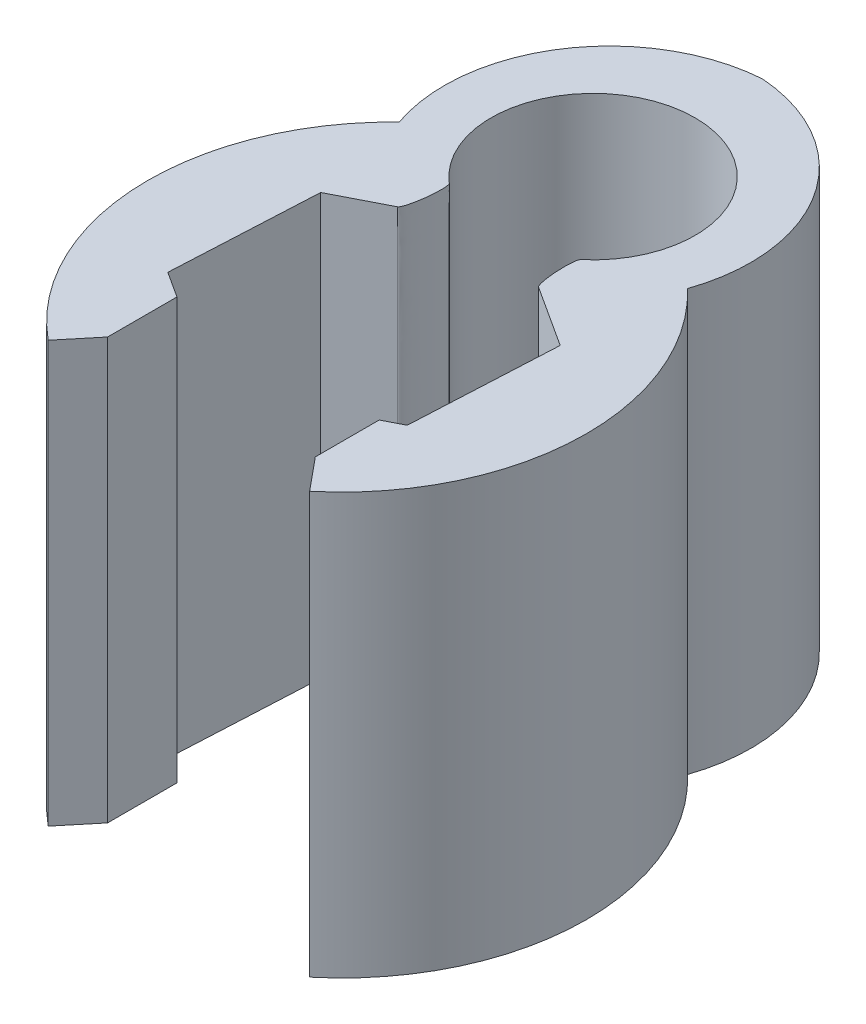
ISO-10303-21;
HEADER;
FILE_DESCRIPTION(('STEP AP214'),'2;1');
FILE_NAME('part.step','',(''),(''),'','','');
FILE_SCHEMA(('AUTOMOTIVE_DESIGN { 1 0 10303 214 1 1 1 1 }'));
ENDSEC;
DATA;
#1=APPLICATION_CONTEXT('core data for automotive mechanical design processes');
#2=APPLICATION_PROTOCOL_DEFINITION('international standard','automotive_design',2000,#1);
#3=PRODUCT_CONTEXT('',#1,'mechanical');
#4=PRODUCT('Part','Part','',(#3));
#5=PRODUCT_RELATED_PRODUCT_CATEGORY('part','',(#4));
#6=PRODUCT_DEFINITION_FORMATION('','',#4);
#7=PRODUCT_DEFINITION_CONTEXT('part definition',#1,'design');
#8=PRODUCT_DEFINITION('design','',#6,#7);
#9=PRODUCT_DEFINITION_SHAPE('','',#8);
#10=(LENGTH_UNIT() NAMED_UNIT(*) SI_UNIT(.MILLI.,.METRE.));
#11=(NAMED_UNIT(*) PLANE_ANGLE_UNIT() SI_UNIT($,.RADIAN.));
#12=(NAMED_UNIT(*) SI_UNIT($,.STERADIAN.) SOLID_ANGLE_UNIT());
#13=UNCERTAINTY_MEASURE_WITH_UNIT(LENGTH_MEASURE(1.E-05),#10,'distance_accuracy_value','');
#14=(GEOMETRIC_REPRESENTATION_CONTEXT(3) GLOBAL_UNCERTAINTY_ASSIGNED_CONTEXT((#13)) GLOBAL_UNIT_ASSIGNED_CONTEXT((#10,
#11,#12)) REPRESENTATION_CONTEXT('',''));
#15=CARTESIAN_POINT('',(0.,0.,0.));
#16=DIRECTION('',(0.,0.,1.));
#17=DIRECTION('',(1.,0.,0.));
#18=AXIS2_PLACEMENT_3D('',#15,#16,#17);
#19=CARTESIAN_POINT('',(-0.598376770378096,19.05,0.494644047014797));
#20=DIRECTION('',(0.770751226655631,0.,-0.637136207265636));
#21=DIRECTION('',(-0.637136207265636,0.,-0.770751226655631));
#22=AXIS2_PLACEMENT_3D('',#19,#20,#21);
#23=PLANE('',#22);
#24=DIRECTION('',(0.637136207265636,0.,0.770751226655631));
#25=VECTOR('',#24,1.);
#26=CARTESIAN_POINT('',(-0.598376770378096,0.,0.494644047014797));
#27=LINE('',#26,#25);
#28=CARTESIAN_POINT('',(4.70120496832042,0.,6.90561093177807));
#29=VERTEX_POINT('',#28);
#30=CARTESIAN_POINT('',(5.9187802535043,0.,8.37852619526394));
#31=VERTEX_POINT('',#30);
#32=EDGE_CURVE('E196',#29,#31,#27,.T.);
#33=ORIENTED_EDGE('',*,*,#32,.T.);
#34=DIRECTION('',(0.,-1.,0.));
#35=VECTOR('',#34,1.);
#36=CARTESIAN_POINT('',(5.9187802535043,19.05,8.37852619526394));
#37=LINE('',#36,#35);
#38=CARTESIAN_POINT('',(5.9187802535043,19.05,8.37852619526394));
#39=VERTEX_POINT('',#38);
#40=EDGE_CURVE('E177',#39,#31,#37,.T.);
#41=ORIENTED_EDGE('',*,*,#40,.F.);
#42=DIRECTION('',(0.637136207265636,0.,0.770751226655631));
#43=VECTOR('',#42,1.);
#44=CARTESIAN_POINT('',(-0.598376770378096,19.05,0.494644047014797));
#45=LINE('',#44,#43);
#46=CARTESIAN_POINT('',(4.70120496832042,19.05,6.90561093177807));
#47=VERTEX_POINT('',#46);
#48=EDGE_CURVE('E183',#47,#39,#45,.T.);
#49=ORIENTED_EDGE('',*,*,#48,.F.);
#50=DIRECTION('',(0.,-1.,0.));
#51=VECTOR('',#50,1.);
#52=CARTESIAN_POINT('',(4.70120496832042,19.05,6.90561093177807));
#53=LINE('',#52,#51);
#54=EDGE_CURVE('E225',#47,#29,#53,.T.);
#55=ORIENTED_EDGE('',*,*,#54,.T.);
#56=EDGE_LOOP('',(#33,#41,#49,#55));
#57=FACE_BOUND('',#56,.T.);
#58=ADVANCED_FACE('F46',(#57),#23,.F.);
#59=CARTESIAN_POINT('',(-1.12456517035275,19.05,-0.141892301269298));
#60=DIRECTION('',(0.,-1.,0.));
#61=DIRECTION('',(0.,0.,-1.));
#62=AXIS2_PLACEMENT_3D('',#59,#60,#61);
#63=CYLINDRICAL_SURFACE('',#62,11.0546933976404);
#64=CARTESIAN_POINT('',(-1.12456517035275,0.,-0.141892301269298));
#65=DIRECTION('',(0.,1.,0.));
#66=DIRECTION('',(0.,0.,1.));
#67=AXIS2_PLACEMENT_3D('',#64,#65,#66);
#68=CIRCLE('',#67,11.0546933976404);
#69=CARTESIAN_POINT('',(6.52662469768185,0.,-8.12096115165017));
#70=VERTEX_POINT('',#69);
#71=EDGE_CURVE('E261',#31,#70,#68,.T.);
#72=ORIENTED_EDGE('',*,*,#71,.T.);
#73=DIRECTION('',(0.,-1.,0.));
#74=VECTOR('',#73,1.);
#75=CARTESIAN_POINT('',(6.52662469768185,19.05,-8.12096115165017));
#76=LINE('',#75,#74);
#77=CARTESIAN_POINT('',(6.52662469768185,19.05,-8.12096115165017));
#78=VERTEX_POINT('',#77);
#79=EDGE_CURVE('E180',#78,#70,#76,.T.);
#80=ORIENTED_EDGE('',*,*,#79,.F.);
#81=CARTESIAN_POINT('',(-1.12456517035275,19.05,-0.141892301269298));
#82=DIRECTION('',(0.,1.,0.));
#83=DIRECTION('',(0.,0.,1.));
#84=AXIS2_PLACEMENT_3D('',#81,#82,#83);
#85=CIRCLE('',#84,11.0546933976404);
#86=EDGE_CURVE('E173',#39,#78,#85,.T.);
#87=ORIENTED_EDGE('',*,*,#86,.F.);
#88=ORIENTED_EDGE('',*,*,#40,.T.);
#89=EDGE_LOOP('',(#72,#80,#87,#88));
#90=FACE_BOUND('',#89,.T.);
#91=ADVANCED_FACE('F175',(#90),#63,.T.);
#92=CARTESIAN_POINT('',(-0.542547571953858,19.05,-10.5725213353697));
#93=DIRECTION('',(0.,-1.,0.));
#94=DIRECTION('',(0.,0.,-1.));
#95=AXIS2_PLACEMENT_3D('',#92,#93,#94);
#96=CYLINDRICAL_SURFACE('',#95,7.48220180910577);
#97=CARTESIAN_POINT('',(-0.542547571953858,0.,-10.5725213353697));
#98=DIRECTION('',(0.,1.,0.));
#99=DIRECTION('',(0.,0.,1.));
#100=AXIS2_PLACEMENT_3D('',#97,#98,#99);
#101=CIRCLE('',#100,7.48220180910577);
#102=CARTESIAN_POINT('',(0.,0.,-18.0350266817231));
#103=VERTEX_POINT('',#102);
#104=EDGE_CURVE('E258',#70,#103,#101,.T.);
#105=ORIENTED_EDGE('',*,*,#104,.T.);
#106=DIRECTION('',(0.,-1.,0.));
#107=VECTOR('',#106,1.);
#108=CARTESIAN_POINT('',(0.,19.05,-18.0350266817231));
#109=LINE('',#108,#107);
#110=CARTESIAN_POINT('',(0.,19.05,-18.0350266817231));
#111=VERTEX_POINT('',#110);
#112=EDGE_CURVE('E201',#111,#103,#109,.T.);
#113=ORIENTED_EDGE('',*,*,#112,.F.);
#114=CARTESIAN_POINT('',(-0.542547571953858,19.05,-10.5725213353697));
#115=DIRECTION('',(0.,1.,0.));
#116=DIRECTION('',(0.,0.,1.));
#117=AXIS2_PLACEMENT_3D('',#114,#115,#116);
#118=CIRCLE('',#117,7.48220180910577);
#119=EDGE_CURVE('E182',#78,#111,#118,.T.);
#120=ORIENTED_EDGE('',*,*,#119,.F.);
#121=ORIENTED_EDGE('',*,*,#79,.T.);
#122=EDGE_LOOP('',(#105,#113,#120,#121));
#123=FACE_BOUND('',#122,.T.);
#124=ADVANCED_FACE('F259',(#123),#96,.T.);
#125=CARTESIAN_POINT('',(0.542547571953858,19.05,-10.5725213353697));
#126=DIRECTION('',(0.,-1.,0.));
#127=DIRECTION('',(0.,0.,-1.));
#128=AXIS2_PLACEMENT_3D('',#125,#126,#127);
#129=CYLINDRICAL_SURFACE('',#128,7.48220180910577);
#130=CARTESIAN_POINT('',(0.542547571953858,0.,-10.5725213353697));
#131=DIRECTION('',(0.,1.,0.));
#132=DIRECTION('',(0.,0.,1.));
#133=AXIS2_PLACEMENT_3D('',#130,#131,#132);
#134=CIRCLE('',#133,7.48220180910577);
#135=CARTESIAN_POINT('',(-6.52662469768186,0.,-8.12096115165017));
#136=VERTEX_POINT('',#135);
#137=EDGE_CURVE('E252',#136,#103,#134,.F.);
#138=ORIENTED_EDGE('',*,*,#137,.F.);
#139=DIRECTION('',(0.,-1.,0.));
#140=VECTOR('',#139,1.);
#141=CARTESIAN_POINT('',(-6.52662469768186,19.05,-8.12096115165017));
#142=LINE('',#141,#140);
#143=CARTESIAN_POINT('',(-6.52662469768186,19.05,-8.12096115165017));
#144=VERTEX_POINT('',#143);
#145=EDGE_CURVE('E244',#144,#136,#142,.T.);
#146=ORIENTED_EDGE('',*,*,#145,.F.);
#147=CARTESIAN_POINT('',(0.542547571953858,19.05,-10.5725213353697));
#148=DIRECTION('',(0.,1.,0.));
#149=DIRECTION('',(0.,0.,1.));
#150=AXIS2_PLACEMENT_3D('',#147,#148,#149);
#151=CIRCLE('',#150,7.48220180910577);
#152=EDGE_CURVE('E255',#144,#111,#151,.F.);
#153=ORIENTED_EDGE('',*,*,#152,.T.);
#154=ORIENTED_EDGE('',*,*,#112,.T.);
#155=EDGE_LOOP('',(#138,#146,#153,#154));
#156=FACE_BOUND('',#155,.T.);
#157=ADVANCED_FACE('F250',(#156),#129,.T.);
#158=CARTESIAN_POINT('',(1.12456517035275,19.05,-0.141892301269298));
#159=DIRECTION('',(0.,-1.,0.));
#160=DIRECTION('',(0.,0.,-1.));
#161=AXIS2_PLACEMENT_3D('',#158,#159,#160);
#162=CYLINDRICAL_SURFACE('',#161,11.0546933976404);
#163=CARTESIAN_POINT('',(1.12456517035275,0.,-0.141892301269298));
#164=DIRECTION('',(0.,1.,0.));
#165=DIRECTION('',(0.,0.,1.));
#166=AXIS2_PLACEMENT_3D('',#163,#164,#165);
#167=CIRCLE('',#166,11.0546933976404);
#168=CARTESIAN_POINT('',(-5.91878025350429,0.,8.37852619526395));
#169=VERTEX_POINT('',#168);
#170=EDGE_CURVE('E266',#169,#136,#167,.F.);
#171=ORIENTED_EDGE('',*,*,#170,.F.);
#172=DIRECTION('',(0.,-1.,0.));
#173=VECTOR('',#172,1.);
#174=CARTESIAN_POINT('',(-5.91878025350429,19.05,8.37852619526395));
#175=LINE('',#174,#173);
#176=CARTESIAN_POINT('',(-5.91878025350429,19.05,8.37852619526395));
#177=VERTEX_POINT('',#176);
#178=EDGE_CURVE('E242',#177,#169,#175,.T.);
#179=ORIENTED_EDGE('',*,*,#178,.F.);
#180=CARTESIAN_POINT('',(1.12456517035275,19.05,-0.141892301269298));
#181=DIRECTION('',(0.,1.,0.));
#182=DIRECTION('',(0.,0.,1.));
#183=AXIS2_PLACEMENT_3D('',#180,#181,#182);
#184=CIRCLE('',#183,11.0546933976404);
#185=EDGE_CURVE('E546',#177,#144,#184,.F.);
#186=ORIENTED_EDGE('',*,*,#185,.T.);
#187=ORIENTED_EDGE('',*,*,#145,.T.);
#188=EDGE_LOOP('',(#171,#179,#186,#187));
#189=FACE_BOUND('',#188,.T.);
#190=ADVANCED_FACE('F507',(#189),#162,.T.);
#191=CARTESIAN_POINT('',(0.598376770378092,19.05,0.494644047014792));
#192=DIRECTION('',(0.770751226655632,0.,0.637136207265635));
#193=DIRECTION('',(0.637136207265635,0.,-0.770751226655632));
#194=AXIS2_PLACEMENT_3D('',#191,#192,#193);
#195=PLANE('',#194);
#196=DIRECTION('',(-0.637136207265635,0.,0.770751226655632));
#197=VECTOR('',#196,1.);
#198=CARTESIAN_POINT('',(0.598376770378092,0.,0.494644047014792));
#199=LINE('',#198,#197);
#200=CARTESIAN_POINT('',(-4.70120496832041,0.,6.90561093177807));
#201=VERTEX_POINT('',#200);
#202=EDGE_CURVE('E268',#201,#169,#199,.T.);
#203=ORIENTED_EDGE('',*,*,#202,.F.);
#204=DIRECTION('',(0.,-1.,0.));
#205=VECTOR('',#204,1.);
#206=CARTESIAN_POINT('',(-4.70120496832041,19.05,6.90561093177807));
#207=LINE('',#206,#205);
#208=CARTESIAN_POINT('',(-4.70120496832041,19.05,6.90561093177807));
#209=VERTEX_POINT('',#208);
#210=EDGE_CURVE('E240',#209,#201,#207,.T.);
#211=ORIENTED_EDGE('',*,*,#210,.F.);
#212=DIRECTION('',(-0.637136207265635,0.,0.770751226655632));
#213=VECTOR('',#212,1.);
#214=CARTESIAN_POINT('',(0.598376770378092,19.05,0.494644047014792));
#215=LINE('',#214,#213);
#216=EDGE_CURVE('E543',#209,#177,#215,.T.);
#217=ORIENTED_EDGE('',*,*,#216,.T.);
#218=ORIENTED_EDGE('',*,*,#178,.T.);
#219=EDGE_LOOP('',(#203,#211,#217,#218));
#220=FACE_BOUND('',#219,.T.);
#221=ADVANCED_FACE('F510',(#220),#195,.T.);
#222=CARTESIAN_POINT('',(-4.70120496832042,19.05,0.));
#223=DIRECTION('',(1.,0.,0.));
#224=DIRECTION('',(0.,0.,-1.));
#225=AXIS2_PLACEMENT_3D('',#222,#223,#224);
#226=PLANE('',#225);
#227=DIRECTION('',(0.,0.,1.));
#228=VECTOR('',#227,1.);
#229=CARTESIAN_POINT('',(-4.70120496832042,0.,0.));
#230=LINE('',#229,#228);
#231=CARTESIAN_POINT('',(-4.70120496832042,0.,3.76579802688678));
#232=VERTEX_POINT('',#231);
#233=EDGE_CURVE('E273',#232,#201,#230,.T.);
#234=ORIENTED_EDGE('',*,*,#233,.F.);
#235=DIRECTION('',(0.,-1.,0.));
#236=VECTOR('',#235,1.);
#237=CARTESIAN_POINT('',(-4.70120496832042,19.05,3.76579802688678));
#238=LINE('',#237,#236);
#239=CARTESIAN_POINT('',(-4.70120496832042,19.05,3.76579802688678));
#240=VERTEX_POINT('',#239);
#241=EDGE_CURVE('E238',#240,#232,#238,.T.);
#242=ORIENTED_EDGE('',*,*,#241,.F.);
#243=DIRECTION('',(0.,0.,1.));
#244=VECTOR('',#243,1.);
#245=CARTESIAN_POINT('',(-4.70120496832042,19.05,0.));
#246=LINE('',#245,#244);
#247=EDGE_CURVE('E538',#240,#209,#246,.T.);
#248=ORIENTED_EDGE('',*,*,#247,.T.);
#249=ORIENTED_EDGE('',*,*,#210,.T.);
#250=EDGE_LOOP('',(#234,#242,#248,#249));
#251=FACE_BOUND('',#250,.T.);
#252=ADVANCED_FACE('F514',(#251),#226,.T.);
#253=CARTESIAN_POINT('',(-3.10319954031292,19.05,4.7991017506406));
#254=DIRECTION('',(0.542992045549067,0.,-0.839737839132214));
#255=DIRECTION('',(-0.839737839132214,0.,-0.542992045549067));
#256=AXIS2_PLACEMENT_3D('',#253,#254,#255);
#257=PLANE('',#256);
#258=DIRECTION('',(0.839737839132214,0.,0.542992045549067));
#259=VECTOR('',#258,1.);
#260=CARTESIAN_POINT('',(-3.10319954031292,0.,4.7991017506406));
#261=LINE('',#260,#259);
#262=CARTESIAN_POINT('',(-5.87396222791367,0.,3.00746866069182));
#263=VERTEX_POINT('',#262);
#264=EDGE_CURVE('E276',#263,#232,#261,.T.);
#265=ORIENTED_EDGE('',*,*,#264,.F.);
#266=DIRECTION('',(0.,-1.,0.));
#267=VECTOR('',#266,1.);
#268=CARTESIAN_POINT('',(-5.87396222791367,19.05,3.00746866069182));
#269=LINE('',#268,#267);
#270=CARTESIAN_POINT('',(-5.87396222791367,19.05,3.00746866069182));
#271=VERTEX_POINT('',#270);
#272=EDGE_CURVE('E236',#271,#263,#269,.T.);
#273=ORIENTED_EDGE('',*,*,#272,.F.);
#274=DIRECTION('',(0.839737839132214,0.,0.542992045549067));
#275=VECTOR('',#274,1.);
#276=CARTESIAN_POINT('',(-3.10319954031292,19.05,4.7991017506406));
#277=LINE('',#276,#275);
#278=EDGE_CURVE('E537',#271,#240,#277,.T.);
#279=ORIENTED_EDGE('',*,*,#278,.T.);
#280=ORIENTED_EDGE('',*,*,#241,.T.);
#281=EDGE_LOOP('',(#265,#273,#279,#280));
#282=FACE_BOUND('',#281,.T.);
#283=ADVANCED_FACE('F518',(#282),#257,.T.);
#284=CARTESIAN_POINT('',(-5.70774380155759,19.05,-0.287898759602873));
#285=DIRECTION('',(0.998730323982081,0.,0.0503759859322613));
#286=DIRECTION('',(0.0503759859322613,0.,-0.998730323982081));
#287=AXIS2_PLACEMENT_3D('',#284,#285,#286);
#288=PLANE('',#287);
#289=DIRECTION('',(-0.0503759859322613,0.,0.998730323982081));
#290=VECTOR('',#289,1.);
#291=CARTESIAN_POINT('',(-5.70774380155759,0.,-0.287898759602873));
#292=LINE('',#291,#290);
#293=CARTESIAN_POINT('',(-5.54152537520151,0.,-3.58326617989757));
#294=VERTEX_POINT('',#293);
#295=EDGE_CURVE('E279',#294,#263,#292,.T.);
#296=ORIENTED_EDGE('',*,*,#295,.F.);
#297=DIRECTION('',(0.,-1.,0.));
#298=VECTOR('',#297,1.);
#299=CARTESIAN_POINT('',(-5.54152537520151,19.05,-3.58326617989757));
#300=LINE('',#299,#298);
#301=CARTESIAN_POINT('',(-5.54152537520151,19.05,-3.58326617989757));
#302=VERTEX_POINT('',#301);
#303=EDGE_CURVE('E233',#302,#294,#300,.T.);
#304=ORIENTED_EDGE('',*,*,#303,.F.);
#305=DIRECTION('',(-0.0503759859322613,0.,0.998730323982081));
#306=VECTOR('',#305,1.);
#307=CARTESIAN_POINT('',(-5.70774380155759,19.05,-0.287898759602873));
#308=LINE('',#307,#306);
#309=EDGE_CURVE('E388',#302,#271,#308,.T.);
#310=ORIENTED_EDGE('',*,*,#309,.T.);
#311=ORIENTED_EDGE('',*,*,#272,.T.);
#312=EDGE_LOOP('',(#296,#304,#310,#311));
#313=FACE_BOUND('',#312,.T.);
#314=ADVANCED_FACE('F521',(#313),#288,.T.);
#315=CARTESIAN_POINT('',(-2.60454426124468,19.05,-5.08700051024348));
#316=DIRECTION('',(0.455738278433015,0.,0.890113825064476));
#317=DIRECTION('',(0.890113825064476,0.,-0.455738278433015));
#318=AXIS2_PLACEMENT_3D('',#315,#316,#317);
#319=PLANE('',#318);
#320=DIRECTION('',(-0.890113825064476,0.,0.455738278433015));
#321=VECTOR('',#320,1.);
#322=CARTESIAN_POINT('',(-2.60454426124468,0.,-5.08700051024348));
#323=LINE('',#322,#321);
#324=CARTESIAN_POINT('',(-3.24270927997033,0.,-4.76026002065594));
#325=VERTEX_POINT('',#324);
#326=EDGE_CURVE('E281',#325,#294,#323,.T.);
#327=ORIENTED_EDGE('',*,*,#326,.F.);
#328=CARTESIAN_POINT('',(-3.24270927997033,20.0025,-4.76026002065594));
#329=CARTESIAN_POINT('',(-3.24270927997033,13.0175,-4.76026002065594));
#330=CARTESIAN_POINT('',(-3.24270927997033,6.03250000000001,-4.76026002065594));
#331=CARTESIAN_POINT('',(-3.24270927997033,-0.952499999999992,-4.76026002065594));
#332=(BOUNDED_CURVE() B_SPLINE_CURVE(3,(#328,#329,#330,#331),.UNSPECIFIED.,.F.,
.F.) B_SPLINE_CURVE_WITH_KNOTS((4,4),(-0.0009525,0.0200025),
.UNSPECIFIED.) CURVE() GEOMETRIC_REPRESENTATION_ITEM() RATIONAL_B_SPLINE_CURVE((1.,1.,1.,1.)) REPRESENTATION_ITEM(''));
#333=CARTESIAN_POINT('',(-3.24270927997033,19.05,-4.76026002065594));
#334=VERTEX_POINT('',#333);
#335=EDGE_CURVE('E12',#325,#334,#332,.F.);
#336=ORIENTED_EDGE('',*,*,#335,.T.);
#337=DIRECTION('',(-0.890113825064476,0.,0.455738278433015));
#338=VECTOR('',#337,1.);
#339=CARTESIAN_POINT('',(-2.60454426124468,19.05,-5.08700051024348));
#340=LINE('',#339,#338);
#341=EDGE_CURVE('E319',#334,#302,#340,.T.);
#342=ORIENTED_EDGE('',*,*,#341,.T.);
#343=ORIENTED_EDGE('',*,*,#303,.T.);
#344=EDGE_LOOP('',(#327,#336,#342,#343));
#345=FACE_BOUND('',#344,.T.);
#346=ADVANCED_FACE('F371',(#345),#319,.T.);
#347=CARTESIAN_POINT('',(0.,19.05,-10.3692276538807));
#348=DIRECTION('',(0.,-1.,0.));
#349=DIRECTION('',(0.,0.,-1.));
#350=AXIS2_PLACEMENT_3D('',#347,#348,#349);
#351=CYLINDRICAL_SURFACE('',#350,4.61735997238747);
#352=CARTESIAN_POINT('',(0.,0.,-10.3692276538807));
#353=DIRECTION('',(0.,1.,0.));
#354=DIRECTION('',(0.,0.,1.));
#355=AXIS2_PLACEMENT_3D('',#352,#353,#354);
#356=CIRCLE('',#355,4.61735997238747);
#357=CARTESIAN_POINT('',(2.97420564902517,0.,-6.83735649656018));
#358=VERTEX_POINT('',#357);
#359=CARTESIAN_POINT('',(-2.99713740518315,0.,-6.85679537851113));
#360=VERTEX_POINT('',#359);
#361=EDGE_CURVE('E210',#358,#360,#356,.T.);
#362=ORIENTED_EDGE('',*,*,#361,.F.);
#363=CARTESIAN_POINT('',(2.97420564902517,20.0025,-6.83735649656018));
#364=CARTESIAN_POINT('',(2.97420564902517,13.0175,-6.83735649656018));
#365=CARTESIAN_POINT('',(2.97420564902518,6.03250000000001,-6.83735649656017));
#366=CARTESIAN_POINT('',(2.97420564902517,-0.95249999999999,-6.83735649656018));
#367=(BOUNDED_CURVE() B_SPLINE_CURVE(3,(#363,#364,#365,#366),.UNSPECIFIED.,.F.,
.F.) B_SPLINE_CURVE_WITH_KNOTS((4,4),(-0.0009525,0.0200025),
.UNSPECIFIED.) CURVE() GEOMETRIC_REPRESENTATION_ITEM() RATIONAL_B_SPLINE_CURVE((1.,1.,1.,1.)) REPRESENTATION_ITEM(''));
#368=CARTESIAN_POINT('',(2.97420564902517,19.05,-6.83735649656018));
#369=VERTEX_POINT('',#368);
#370=EDGE_CURVE('E455',#358,#369,#367,.F.);
#371=ORIENTED_EDGE('',*,*,#370,.T.);
#372=CARTESIAN_POINT('',(0.,19.05,-10.3692276538807));
#373=DIRECTION('',(0.,1.,0.));
#374=DIRECTION('',(0.,0.,1.));
#375=AXIS2_PLACEMENT_3D('',#372,#373,#374);
#376=CIRCLE('',#375,4.61735997238747);
#377=CARTESIAN_POINT('',(-2.99713740518315,19.05,-6.85679537851113));
#378=VERTEX_POINT('',#377);
#379=EDGE_CURVE('E311',#369,#378,#376,.T.);
#380=ORIENTED_EDGE('',*,*,#379,.T.);
#381=CARTESIAN_POINT('',(-2.99713740518315,-0.95249999999999,-6.85679537851113));
#382=CARTESIAN_POINT('',(-2.99713740518316,6.03250000000001,-6.85679537851112));
#383=CARTESIAN_POINT('',(-2.99713740518315,13.0175,-6.85679537851113));
#384=CARTESIAN_POINT('',(-2.99713740518315,20.0025,-6.85679537851113));
#385=(BOUNDED_CURVE() B_SPLINE_CURVE(3,(#381,#382,#383,#384),.UNSPECIFIED.,.F.,
.F.) B_SPLINE_CURVE_WITH_KNOTS((4,4),(-0.000952499999999998,0.0200025),
.UNSPECIFIED.) CURVE() GEOMETRIC_REPRESENTATION_ITEM() RATIONAL_B_SPLINE_CURVE((1.,1.,1.,1.)) REPRESENTATION_ITEM(''));
#386=EDGE_CURVE('E476',#378,#360,#385,.F.);
#387=ORIENTED_EDGE('',*,*,#386,.T.);
#388=EDGE_LOOP('',(#362,#371,#380,#387));
#389=FACE_BOUND('',#388,.T.);
#390=ADVANCED_FACE('F367',(#389),#351,.F.);
#391=CARTESIAN_POINT('',(3.10319954031291,19.05,-4.79910175064061));
#392=DIRECTION('',(-0.542992045549066,0.,0.839737839132214));
#393=DIRECTION('',(0.839737839132214,0.,0.542992045549066));
#394=AXIS2_PLACEMENT_3D('',#391,#392,#393);
#395=PLANE('',#394);
#396=DIRECTION('',(-0.839737839132214,0.,-0.542992045549066));
#397=VECTOR('',#396,1.);
#398=CARTESIAN_POINT('',(3.10319954031291,19.05,-4.79910175064061));
#399=LINE('',#398,#397);
#400=CARTESIAN_POINT('',(5.87396222791367,19.05,-3.00746866069182));
#401=VERTEX_POINT('',#400);
#402=CARTESIAN_POINT('',(3.10265788418253,19.05,-4.79945199682044));
#403=VERTEX_POINT('',#402);
#404=EDGE_CURVE('E211',#401,#403,#399,.T.);
#405=ORIENTED_EDGE('',*,*,#404,.T.);
#406=CARTESIAN_POINT('',(3.10265788418253,-0.952499999999992,-4.79945199682044));
#407=CARTESIAN_POINT('',(3.10265788418253,6.03250000000001,-4.79945199682044));
#408=CARTESIAN_POINT('',(3.10265788418253,13.0175,-4.79945199682044));
#409=CARTESIAN_POINT('',(3.10265788418253,20.0025,-4.79945199682044));
#410=(BOUNDED_CURVE() B_SPLINE_CURVE(3,(#406,#407,#408,#409),.UNSPECIFIED.,.F.,
.F.) B_SPLINE_CURVE_WITH_KNOTS((4,4),(-0.000952499999999998,0.0200025),
.UNSPECIFIED.) CURVE() GEOMETRIC_REPRESENTATION_ITEM() RATIONAL_B_SPLINE_CURVE((1.,1.,1.,1.)) REPRESENTATION_ITEM(''));
#411=CARTESIAN_POINT('',(3.10265788418253,0.,-4.79945199682044));
#412=VERTEX_POINT('',#411);
#413=EDGE_CURVE('E197',#403,#412,#410,.F.);
#414=ORIENTED_EDGE('',*,*,#413,.T.);
#415=DIRECTION('',(-0.839737839132214,0.,-0.542992045549066));
#416=VECTOR('',#415,1.);
#417=CARTESIAN_POINT('',(3.10319954031291,0.,-4.79910175064061));
#418=LINE('',#417,#416);
#419=CARTESIAN_POINT('',(5.87396222791367,0.,-3.00746866069182));
#420=VERTEX_POINT('',#419);
#421=EDGE_CURVE('E205',#420,#412,#418,.T.);
#422=ORIENTED_EDGE('',*,*,#421,.F.);
#423=DIRECTION('',(0.,-1.,0.));
#424=VECTOR('',#423,1.);
#425=CARTESIAN_POINT('',(5.87396222791367,19.05,-3.00746866069182));
#426=LINE('',#425,#424);
#427=EDGE_CURVE('E231',#401,#420,#426,.T.);
#428=ORIENTED_EDGE('',*,*,#427,.F.);
#429=EDGE_LOOP('',(#405,#414,#422,#428));
#430=FACE_BOUND('',#429,.T.);
#431=ADVANCED_FACE('F349',(#430),#395,.T.);
#432=CARTESIAN_POINT('',(5.70774380155759,19.05,0.287898759602873));
#433=DIRECTION('',(-0.998730323982081,0.,-0.0503759859322612));
#434=DIRECTION('',(-0.0503759859322612,0.,0.998730323982081));
#435=AXIS2_PLACEMENT_3D('',#432,#433,#434);
#436=PLANE('',#435);
#437=DIRECTION('',(0.0503759859322612,0.,-0.998730323982081));
#438=VECTOR('',#437,1.);
#439=CARTESIAN_POINT('',(5.70774380155759,0.,0.287898759602873));
#440=LINE('',#439,#438);
#441=CARTESIAN_POINT('',(5.54152537520151,0.,3.58326617989757));
#442=VERTEX_POINT('',#441);
#443=EDGE_CURVE('E209',#442,#420,#440,.T.);
#444=ORIENTED_EDGE('',*,*,#443,.F.);
#445=DIRECTION('',(0.,-1.,0.));
#446=VECTOR('',#445,1.);
#447=CARTESIAN_POINT('',(5.54152537520151,19.05,3.58326617989757));
#448=LINE('',#447,#446);
#449=CARTESIAN_POINT('',(5.54152537520151,19.05,3.58326617989757));
#450=VERTEX_POINT('',#449);
#451=EDGE_CURVE('E229',#450,#442,#448,.T.);
#452=ORIENTED_EDGE('',*,*,#451,.F.);
#453=DIRECTION('',(0.0503759859322612,0.,-0.998730323982081));
#454=VECTOR('',#453,1.);
#455=CARTESIAN_POINT('',(5.70774380155759,19.05,0.287898759602873));
#456=LINE('',#455,#454);
#457=EDGE_CURVE('E328',#450,#401,#456,.T.);
#458=ORIENTED_EDGE('',*,*,#457,.T.);
#459=ORIENTED_EDGE('',*,*,#427,.T.);
#460=EDGE_LOOP('',(#444,#452,#458,#459));
#461=FACE_BOUND('',#460,.T.);
#462=ADVANCED_FACE('F343',(#461),#436,.T.);
#463=CARTESIAN_POINT('',(2.60454426124468,19.05,5.08700051024348));
#464=DIRECTION('',(-0.455738278433015,0.,-0.890113825064476));
#465=DIRECTION('',(-0.890113825064476,0.,0.455738278433015));
#466=AXIS2_PLACEMENT_3D('',#463,#464,#465);
#467=PLANE('',#466);
#468=DIRECTION('',(0.890113825064476,0.,-0.455738278433015));
#469=VECTOR('',#468,1.);
#470=CARTESIAN_POINT('',(2.60454426124468,0.,5.08700051024348));
#471=LINE('',#470,#469);
#472=CARTESIAN_POINT('',(4.70120496832042,0.,4.01351022822069));
#473=VERTEX_POINT('',#472);
#474=EDGE_CURVE('E221',#473,#442,#471,.T.);
#475=ORIENTED_EDGE('',*,*,#474,.F.);
#476=DIRECTION('',(0.,-1.,0.));
#477=VECTOR('',#476,1.);
#478=CARTESIAN_POINT('',(4.70120496832042,19.05,4.01351022822069));
#479=LINE('',#478,#477);
#480=CARTESIAN_POINT('',(4.70120496832042,19.05,4.01351022822069));
#481=VERTEX_POINT('',#480);
#482=EDGE_CURVE('E227',#481,#473,#479,.T.);
#483=ORIENTED_EDGE('',*,*,#482,.F.);
#484=DIRECTION('',(0.890113825064476,0.,-0.455738278433015));
#485=VECTOR('',#484,1.);
#486=CARTESIAN_POINT('',(2.60454426124468,19.05,5.08700051024348));
#487=LINE('',#486,#485);
#488=EDGE_CURVE('E331',#481,#450,#487,.T.);
#489=ORIENTED_EDGE('',*,*,#488,.T.);
#490=ORIENTED_EDGE('',*,*,#451,.T.);
#491=EDGE_LOOP('',(#475,#483,#489,#490));
#492=FACE_BOUND('',#491,.T.);
#493=ADVANCED_FACE('F339',(#492),#467,.T.);
#494=CARTESIAN_POINT('',(4.70120496832042,19.05,0.));
#495=DIRECTION('',(1.,0.,0.));
#496=DIRECTION('',(0.,0.,-1.));
#497=AXIS2_PLACEMENT_3D('',#494,#495,#496);
#498=PLANE('',#497);
#499=DIRECTION('',(0.,0.,1.));
#500=VECTOR('',#499,1.);
#501=CARTESIAN_POINT('',(4.70120496832042,0.,0.));
#502=LINE('',#501,#500);
#503=EDGE_CURVE('E193',#473,#29,#502,.T.);
#504=ORIENTED_EDGE('',*,*,#503,.T.);
#505=ORIENTED_EDGE('',*,*,#54,.F.);
#506=DIRECTION('',(0.,0.,1.));
#507=VECTOR('',#506,1.);
#508=CARTESIAN_POINT('',(4.70120496832042,19.05,0.));
#509=LINE('',#508,#507);
#510=EDGE_CURVE('E189',#481,#47,#509,.T.);
#511=ORIENTED_EDGE('',*,*,#510,.F.);
#512=ORIENTED_EDGE('',*,*,#482,.T.);
#513=EDGE_LOOP('',(#504,#505,#511,#512));
#514=FACE_BOUND('',#513,.T.);
#515=ADVANCED_FACE('F305',(#514),#498,.F.);
#516=CARTESIAN_POINT('',(0.,19.05,0.));
#517=DIRECTION('',(0.,1.,0.));
#518=DIRECTION('',(0.,0.,1.));
#519=AXIS2_PLACEMENT_3D('',#516,#517,#518);
#520=PLANE('',#519);
#521=ORIENTED_EDGE('',*,*,#379,.F.);
#522=CARTESIAN_POINT('',(3.10265788418253,19.05,-4.79945199682044));
#523=CARTESIAN_POINT('',(1.66110640734555,19.05,-5.73158932432362));
#524=CARTESIAN_POINT('',(2.97420564902517,19.05,-6.83735649656018));
#525=(BOUNDED_CURVE() B_SPLINE_CURVE(2,(#522,#523,#524),.UNSPECIFIED.,.F.,
.F.) B_SPLINE_CURVE_WITH_KNOTS((3,3),(0.,1.),
.UNSPECIFIED.) CURVE() GEOMETRIC_REPRESENTATION_ITEM() RATIONAL_B_SPLINE_CURVE((1.,
0.118948345896042,1.)) REPRESENTATION_ITEM(''));
#526=EDGE_CURVE('E60',#369,#403,#525,.F.);
#527=ORIENTED_EDGE('',*,*,#526,.T.);
#528=ORIENTED_EDGE('',*,*,#404,.F.);
#529=ORIENTED_EDGE('',*,*,#457,.F.);
#530=ORIENTED_EDGE('',*,*,#488,.F.);
#531=ORIENTED_EDGE('',*,*,#510,.T.);
#532=ORIENTED_EDGE('',*,*,#48,.T.);
#533=ORIENTED_EDGE('',*,*,#86,.T.);
#534=ORIENTED_EDGE('',*,*,#119,.T.);
#535=ORIENTED_EDGE('',*,*,#152,.F.);
#536=ORIENTED_EDGE('',*,*,#185,.F.);
#537=ORIENTED_EDGE('',*,*,#216,.F.);
#538=ORIENTED_EDGE('',*,*,#247,.F.);
#539=ORIENTED_EDGE('',*,*,#278,.F.);
#540=ORIENTED_EDGE('',*,*,#309,.F.);
#541=ORIENTED_EDGE('',*,*,#341,.F.);
#542=CARTESIAN_POINT('',(-2.99713740518315,19.05,-6.85679537851113));
#543=CARTESIAN_POINT('',(-1.55363692098566,19.05,-5.6250650684561));
#544=CARTESIAN_POINT('',(-3.24270927997033,19.05,-4.76026002065594));
#545=(BOUNDED_CURVE() B_SPLINE_CURVE(2,(#542,#543,#544),.UNSPECIFIED.,.F.,
.F.) B_SPLINE_CURVE_WITH_KNOTS((3,3),(0.,1.),
.UNSPECIFIED.) CURVE() GEOMETRIC_REPRESENTATION_ITEM() RATIONAL_B_SPLINE_CURVE((1.,
0.111239360045646,1.)) REPRESENTATION_ITEM(''));
#546=EDGE_CURVE('E73',#334,#378,#545,.F.);
#547=ORIENTED_EDGE('',*,*,#546,.T.);
#548=EDGE_LOOP('',(#521,#527,#528,#529,#530,#531,#532,#533,#534,#535,#536,#537,#538,#539,#540,
#541,#547));
#549=FACE_BOUND('',#548,.T.);
#550=ADVANCED_FACE('F186',(#549),#520,.T.);
#551=CARTESIAN_POINT('',(0.,0.,0.));
#552=DIRECTION('',(0.,1.,0.));
#553=DIRECTION('',(0.,0.,1.));
#554=AXIS2_PLACEMENT_3D('',#551,#552,#553);
#555=PLANE('',#554);
#556=ORIENTED_EDGE('',*,*,#421,.T.);
#557=CARTESIAN_POINT('',(2.97420564902517,0.,-6.83735649656018));
#558=CARTESIAN_POINT('',(1.66110640734555,0.,-5.73158932432362));
#559=CARTESIAN_POINT('',(3.10265788418253,0.,-4.79945199682044));
#560=(BOUNDED_CURVE() B_SPLINE_CURVE(2,(#557,#558,#559),.UNSPECIFIED.,.F.,
.F.) B_SPLINE_CURVE_WITH_KNOTS((3,3),(0.,1.),
.UNSPECIFIED.) CURVE() GEOMETRIC_REPRESENTATION_ITEM() RATIONAL_B_SPLINE_CURVE((1.,
0.118948345896042,1.)) REPRESENTATION_ITEM(''));
#561=EDGE_CURVE('E345',#412,#358,#560,.F.);
#562=ORIENTED_EDGE('',*,*,#561,.T.);
#563=ORIENTED_EDGE('',*,*,#361,.T.);
#564=CARTESIAN_POINT('',(-3.24270927997033,0.,-4.76026002065594));
#565=CARTESIAN_POINT('',(-1.55363692098566,0.,-5.6250650684561));
#566=CARTESIAN_POINT('',(-2.99713740518315,0.,-6.85679537851113));
#567=(BOUNDED_CURVE() B_SPLINE_CURVE(2,(#564,#565,#566),.UNSPECIFIED.,.F.,
.F.) B_SPLINE_CURVE_WITH_KNOTS((3,3),(0.,1.),
.UNSPECIFIED.) CURVE() GEOMETRIC_REPRESENTATION_ITEM() RATIONAL_B_SPLINE_CURVE((1.,
0.111239360045646,1.)) REPRESENTATION_ITEM(''));
#568=EDGE_CURVE('E200',#360,#325,#567,.F.);
#569=ORIENTED_EDGE('',*,*,#568,.T.);
#570=ORIENTED_EDGE('',*,*,#326,.T.);
#571=ORIENTED_EDGE('',*,*,#295,.T.);
#572=ORIENTED_EDGE('',*,*,#264,.T.);
#573=ORIENTED_EDGE('',*,*,#233,.T.);
#574=ORIENTED_EDGE('',*,*,#202,.T.);
#575=ORIENTED_EDGE('',*,*,#170,.T.);
#576=ORIENTED_EDGE('',*,*,#137,.T.);
#577=ORIENTED_EDGE('',*,*,#104,.F.);
#578=ORIENTED_EDGE('',*,*,#71,.F.);
#579=ORIENTED_EDGE('',*,*,#32,.F.);
#580=ORIENTED_EDGE('',*,*,#503,.F.);
#581=ORIENTED_EDGE('',*,*,#474,.T.);
#582=ORIENTED_EDGE('',*,*,#443,.T.);
#583=EDGE_LOOP('',(#556,#562,#563,#569,#570,#571,#572,#573,#574,#575,#576,#577,#578,#579,#580,
#581,#582));
#584=FACE_BOUND('',#583,.T.);
#585=ADVANCED_FACE('F263',(#584),#555,.F.);
#586=CARTESIAN_POINT('',(3.10265788418253,20.0025,-4.79945199682044));
#587=CARTESIAN_POINT('',(3.10265788418253,13.0175,-4.79945199682044));
#588=CARTESIAN_POINT('',(3.10265788418253,6.03250000000001,-4.79945199682044));
#589=CARTESIAN_POINT('',(3.10265788418253,-0.952499999999992,-4.79945199682044));
#590=CARTESIAN_POINT('',(1.66110640734555,20.0025,-5.73158932432362));
#591=CARTESIAN_POINT('',(1.66110640734555,13.0175,-5.73158932432362));
#592=CARTESIAN_POINT('',(1.66110640734555,6.03250000000001,-5.73158932432362));
#593=CARTESIAN_POINT('',(1.66110640734555,-0.952499999999989,-5.73158932432362));
#594=CARTESIAN_POINT('',(2.97420564902517,20.0025,-6.83735649656018));
#595=CARTESIAN_POINT('',(2.97420564902517,13.0175,-6.83735649656018));
#596=CARTESIAN_POINT('',(2.97420564902518,6.03250000000001,-6.83735649656017));
#597=CARTESIAN_POINT('',(2.97420564902517,-0.95249999999999,-6.83735649656018));
#598=(BOUNDED_SURFACE() B_SPLINE_SURFACE(2,3,((#586,#587,#588,#589),(#590,#591,#592,#593),(#594,
#595,#596,#597)),.UNSPECIFIED.,.F.,.F.,.F.) B_SPLINE_SURFACE_WITH_KNOTS((3,3),(4,4),(0.,1.),
(-0.0009525,0.0200025),
.UNSPECIFIED.) GEOMETRIC_REPRESENTATION_ITEM() RATIONAL_B_SPLINE_SURFACE(((1.,1.,1.,1.),
(0.118948345896042,0.118948345896042,0.118948345896042,0.118948345896042),(1.,1.,1.,1.))) REPRESENTATION_ITEM('') SURFACE());
#599=ORIENTED_EDGE('',*,*,#526,.F.);
#600=ORIENTED_EDGE('',*,*,#370,.F.);
#601=ORIENTED_EDGE('',*,*,#561,.F.);
#602=ORIENTED_EDGE('',*,*,#413,.F.);
#603=EDGE_LOOP('',(#599,#600,#601,#602));
#604=FACE_BOUND('',#603,.T.);
#605=ADVANCED_FACE('F303',(#604),#598,.T.);
#606=CARTESIAN_POINT('',(-2.99713740518315,20.0025,-6.85679537851113));
#607=CARTESIAN_POINT('',(-2.99713740518315,13.0175,-6.85679537851113));
#608=CARTESIAN_POINT('',(-2.99713740518316,6.03250000000001,-6.85679537851112));
#609=CARTESIAN_POINT('',(-2.99713740518315,-0.95249999999999,-6.85679537851113));
#610=CARTESIAN_POINT('',(-1.55363692098566,20.0025,-5.6250650684561));
#611=CARTESIAN_POINT('',(-1.55363692098566,13.0175,-5.6250650684561));
#612=CARTESIAN_POINT('',(-1.55363692098566,6.0325,-5.6250650684561));
#613=CARTESIAN_POINT('',(-1.55363692098566,-0.952499999999989,-5.6250650684561));
#614=CARTESIAN_POINT('',(-3.24270927997033,20.0025,-4.76026002065594));
#615=CARTESIAN_POINT('',(-3.24270927997033,13.0175,-4.76026002065594));
#616=CARTESIAN_POINT('',(-3.24270927997033,6.03250000000001,-4.76026002065594));
#617=CARTESIAN_POINT('',(-3.24270927997033,-0.952499999999992,-4.76026002065594));
#618=(BOUNDED_SURFACE() B_SPLINE_SURFACE(2,3,((#606,#607,#608,#609),(#610,#611,#612,#613),(#614,
#615,#616,#617)),.UNSPECIFIED.,.F.,.F.,.F.) B_SPLINE_SURFACE_WITH_KNOTS((3,3),(4,4),(0.,1.),
(-0.0009525,0.0200025),
.UNSPECIFIED.) GEOMETRIC_REPRESENTATION_ITEM() RATIONAL_B_SPLINE_SURFACE(((1.,1.,1.,1.),
(0.111239360045646,0.111239360045646,0.111239360045646,0.111239360045646),(1.,1.,1.,1.))) REPRESENTATION_ITEM('') SURFACE());
#619=ORIENTED_EDGE('',*,*,#546,.F.);
#620=ORIENTED_EDGE('',*,*,#335,.F.);
#621=ORIENTED_EDGE('',*,*,#568,.F.);
#622=ORIENTED_EDGE('',*,*,#386,.F.);
#623=EDGE_LOOP('',(#619,#620,#621,#622));
#624=FACE_BOUND('',#623,.T.);
#625=ADVANCED_FACE('F49',(#624),#618,.T.);
#626=CLOSED_SHELL('',(#58,#91,#124,#157,#190,#221,#252,#283,#314,#346,#390,#431,#462,#493,#515,
#550,#585,#605,#625));
#627=MANIFOLD_SOLID_BREP('B2',#626);
#628=ADVANCED_BREP_SHAPE_REPRESENTATION('',(#18,#627),#14);
#629=SHAPE_DEFINITION_REPRESENTATION(#9,#628);
ENDSEC;
END-ISO-10303-21;
